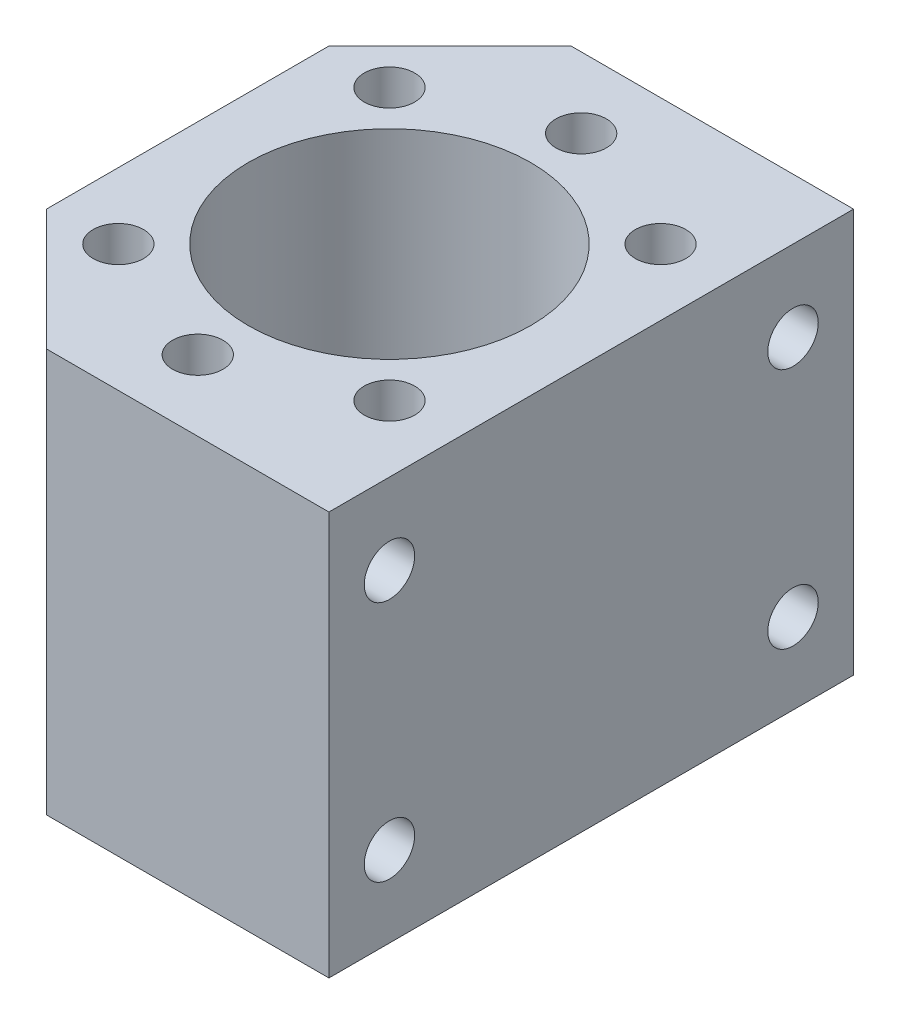
ISO-10303-21;
HEADER;
FILE_DESCRIPTION(('STEP AP214'),'2;1');
FILE_NAME('part.step','',(''),(''),'','','');
FILE_SCHEMA(('AUTOMOTIVE_DESIGN { 1 0 10303 214 1 1 1 1 }'));
ENDSEC;
DATA;
#1=APPLICATION_CONTEXT('core data for automotive mechanical design processes');
#2=APPLICATION_PROTOCOL_DEFINITION('international standard','automotive_design',2000,#1);
#3=PRODUCT_CONTEXT('',#1,'mechanical');
#4=PRODUCT('Part','Part','',(#3));
#5=PRODUCT_RELATED_PRODUCT_CATEGORY('part','',(#4));
#6=PRODUCT_DEFINITION_FORMATION('','',#4);
#7=PRODUCT_DEFINITION_CONTEXT('part definition',#1,'design');
#8=PRODUCT_DEFINITION('design','',#6,#7);
#9=PRODUCT_DEFINITION_SHAPE('','',#8);
#10=(LENGTH_UNIT() NAMED_UNIT(*) SI_UNIT(.MILLI.,.METRE.));
#11=(NAMED_UNIT(*) PLANE_ANGLE_UNIT() SI_UNIT($,.RADIAN.));
#12=(NAMED_UNIT(*) SI_UNIT($,.STERADIAN.) SOLID_ANGLE_UNIT());
#13=UNCERTAINTY_MEASURE_WITH_UNIT(LENGTH_MEASURE(1.E-05),#10,'distance_accuracy_value','');
#14=(GEOMETRIC_REPRESENTATION_CONTEXT(3) GLOBAL_UNCERTAINTY_ASSIGNED_CONTEXT((#13)) GLOBAL_UNIT_ASSIGNED_CONTEXT((#10,
#11,#12)) REPRESENTATION_CONTEXT('',''));
#15=CARTESIAN_POINT('',(0.,0.,0.));
#16=DIRECTION('',(0.,0.,1.));
#17=DIRECTION('',(1.,0.,0.));
#18=AXIS2_PLACEMENT_3D('',#15,#16,#17);
#19=CARTESIAN_POINT('',(0.,40.,52.));
#20=DIRECTION('',(1.,0.,0.));
#21=DIRECTION('',(0.,0.,-1.));
#22=AXIS2_PLACEMENT_3D('',#19,#20,#21);
#23=PLANE('',#22);
#24=DIRECTION('',(0.,0.,1.));
#25=VECTOR('',#24,1.);
#26=CARTESIAN_POINT('',(0.,40.,52.));
#27=LINE('',#26,#25);
#28=CARTESIAN_POINT('',(0.,40.,12.));
#29=VERTEX_POINT('',#28);
#30=CARTESIAN_POINT('',(0.,40.,40.));
#31=VERTEX_POINT('',#30);
#32=EDGE_CURVE('E109',#29,#31,#27,.T.);
#33=ORIENTED_EDGE('',*,*,#32,.F.);
#34=DIRECTION('',(0.,1.,0.));
#35=VECTOR('',#34,1.);
#36=CARTESIAN_POINT('',(0.,0.,12.));
#37=LINE('',#36,#35);
#38=CARTESIAN_POINT('',(0.,0.,12.));
#39=VERTEX_POINT('',#38);
#40=EDGE_CURVE('E101',#39,#29,#37,.T.);
#41=ORIENTED_EDGE('',*,*,#40,.F.);
#42=DIRECTION('',(0.,0.,1.));
#43=VECTOR('',#42,1.);
#44=CARTESIAN_POINT('',(0.,0.,52.));
#45=LINE('',#44,#43);
#46=CARTESIAN_POINT('',(0.,0.,40.));
#47=VERTEX_POINT('',#46);
#48=EDGE_CURVE('E70',#39,#47,#45,.T.);
#49=ORIENTED_EDGE('',*,*,#48,.T.);
#50=DIRECTION('',(0.,1.,0.));
#51=VECTOR('',#50,1.);
#52=CARTESIAN_POINT('',(0.,0.,40.));
#53=LINE('',#52,#51);
#54=EDGE_CURVE('E143',#47,#31,#53,.T.);
#55=ORIENTED_EDGE('',*,*,#54,.T.);
#56=EDGE_LOOP('',(#33,#41,#49,#55));
#57=FACE_BOUND('',#56,.T.);
#58=ADVANCED_FACE('F48',(#57),#23,.F.);
#59=CARTESIAN_POINT('',(40.,40.,52.));
#60=DIRECTION('',(0.,0.,-1.));
#61=DIRECTION('',(-1.,0.,0.));
#62=AXIS2_PLACEMENT_3D('',#59,#60,#61);
#63=PLANE('',#62);
#64=DIRECTION('',(1.,0.,0.));
#65=VECTOR('',#64,1.);
#66=CARTESIAN_POINT('',(40.,40.,52.));
#67=LINE('',#66,#65);
#68=CARTESIAN_POINT('',(12.,40.,52.));
#69=VERTEX_POINT('',#68);
#70=CARTESIAN_POINT('',(40.,40.,52.));
#71=VERTEX_POINT('',#70);
#72=EDGE_CURVE('E137',#69,#71,#67,.T.);
#73=ORIENTED_EDGE('',*,*,#72,.F.);
#74=DIRECTION('',(0.,1.,0.));
#75=VECTOR('',#74,1.);
#76=CARTESIAN_POINT('',(12.,0.,52.));
#77=LINE('',#76,#75);
#78=CARTESIAN_POINT('',(12.,0.,52.));
#79=VERTEX_POINT('',#78);
#80=EDGE_CURVE('E145',#79,#69,#77,.T.);
#81=ORIENTED_EDGE('',*,*,#80,.F.);
#82=DIRECTION('',(1.,0.,0.));
#83=VECTOR('',#82,1.);
#84=CARTESIAN_POINT('',(40.,0.,52.));
#85=LINE('',#84,#83);
#86=CARTESIAN_POINT('',(40.,0.,52.));
#87=VERTEX_POINT('',#86);
#88=EDGE_CURVE('E116',#79,#87,#85,.T.);
#89=ORIENTED_EDGE('',*,*,#88,.T.);
#90=DIRECTION('',(0.,-1.,0.));
#91=VECTOR('',#90,1.);
#92=CARTESIAN_POINT('',(40.,40.,52.));
#93=LINE('',#92,#91);
#94=EDGE_CURVE('E13',#71,#87,#93,.T.);
#95=ORIENTED_EDGE('',*,*,#94,.F.);
#96=EDGE_LOOP('',(#73,#81,#89,#95));
#97=FACE_BOUND('',#96,.T.);
#98=ADVANCED_FACE('F229',(#97),#63,.F.);
#99=CARTESIAN_POINT('',(40.,40.,0.));
#100=DIRECTION('',(-1.,0.,0.));
#101=DIRECTION('',(0.,0.,1.));
#102=AXIS2_PLACEMENT_3D('',#99,#100,#101);
#103=PLANE('',#102);
#104=CARTESIAN_POINT('',(40.,32.,6.));
#105=DIRECTION('',(1.,0.,0.));
#106=DIRECTION('',(0.,0.,-1.));
#107=AXIS2_PLACEMENT_3D('',#104,#105,#106);
#108=CIRCLE('',#107,2.5);
#109=CARTESIAN_POINT('',(40.,32.,3.5));
#110=VERTEX_POINT('',#109);
#111=EDGE_CURVE('E210',#110,#110,#108,.T.);
#112=ORIENTED_EDGE('',*,*,#111,.F.);
#113=EDGE_LOOP('',(#112));
#114=FACE_BOUND('',#113,.T.);
#115=CARTESIAN_POINT('',(40.,8.,6.));
#116=DIRECTION('',(1.,0.,0.));
#117=DIRECTION('',(0.,0.,-1.));
#118=AXIS2_PLACEMENT_3D('',#115,#116,#117);
#119=CIRCLE('',#118,2.5);
#120=CARTESIAN_POINT('',(40.,8.,3.5));
#121=VERTEX_POINT('',#120);
#122=EDGE_CURVE('E203',#121,#121,#119,.T.);
#123=ORIENTED_EDGE('',*,*,#122,.F.);
#124=EDGE_LOOP('',(#123));
#125=FACE_BOUND('',#124,.T.);
#126=CARTESIAN_POINT('',(40.,8.,46.));
#127=DIRECTION('',(1.,0.,0.));
#128=DIRECTION('',(0.,0.,-1.));
#129=AXIS2_PLACEMENT_3D('',#126,#127,#128);
#130=CIRCLE('',#129,2.5);
#131=CARTESIAN_POINT('',(40.,8.,43.5));
#132=VERTEX_POINT('',#131);
#133=EDGE_CURVE('E197',#132,#132,#130,.T.);
#134=ORIENTED_EDGE('',*,*,#133,.F.);
#135=EDGE_LOOP('',(#134));
#136=FACE_BOUND('',#135,.T.);
#137=CARTESIAN_POINT('',(40.,32.,46.));
#138=DIRECTION('',(1.,0.,0.));
#139=DIRECTION('',(0.,0.,-1.));
#140=AXIS2_PLACEMENT_3D('',#137,#138,#139);
#141=CIRCLE('',#140,2.5);
#142=CARTESIAN_POINT('',(40.,32.,43.5));
#143=VERTEX_POINT('',#142);
#144=EDGE_CURVE('E191',#143,#143,#141,.T.);
#145=ORIENTED_EDGE('',*,*,#144,.F.);
#146=EDGE_LOOP('',(#145));
#147=FACE_BOUND('',#146,.T.);
#148=DIRECTION('',(0.,0.,-1.));
#149=VECTOR('',#148,1.);
#150=CARTESIAN_POINT('',(40.,0.,0.));
#151=LINE('',#150,#149);
#152=CARTESIAN_POINT('',(40.,0.,0.));
#153=VERTEX_POINT('',#152);
#154=EDGE_CURVE('E119',#87,#153,#151,.T.);
#155=ORIENTED_EDGE('',*,*,#154,.T.);
#156=DIRECTION('',(0.,-1.,0.));
#157=VECTOR('',#156,1.);
#158=CARTESIAN_POINT('',(40.,40.,0.));
#159=LINE('',#158,#157);
#160=CARTESIAN_POINT('',(40.,40.,0.));
#161=VERTEX_POINT('',#160);
#162=EDGE_CURVE('E55',#161,#153,#159,.T.);
#163=ORIENTED_EDGE('',*,*,#162,.F.);
#164=DIRECTION('',(0.,0.,-1.));
#165=VECTOR('',#164,1.);
#166=CARTESIAN_POINT('',(40.,40.,0.));
#167=LINE('',#166,#165);
#168=EDGE_CURVE('E135',#71,#161,#167,.T.);
#169=ORIENTED_EDGE('',*,*,#168,.F.);
#170=ORIENTED_EDGE('',*,*,#94,.T.);
#171=EDGE_LOOP('',(#155,#163,#169,#170));
#172=FACE_BOUND('',#171,.T.);
#173=ADVANCED_FACE('F225',(#114,#125,#136,#147,#172),#103,.F.);
#174=CARTESIAN_POINT('',(0.,40.,0.));
#175=DIRECTION('',(0.,0.,1.));
#176=DIRECTION('',(1.,0.,0.));
#177=AXIS2_PLACEMENT_3D('',#174,#175,#176);
#178=PLANE('',#177);
#179=DIRECTION('',(-1.,0.,0.));
#180=VECTOR('',#179,1.);
#181=CARTESIAN_POINT('',(0.,0.,0.));
#182=LINE('',#181,#180);
#183=CARTESIAN_POINT('',(12.,0.,0.));
#184=VERTEX_POINT('',#183);
#185=EDGE_CURVE('E129',#153,#184,#182,.T.);
#186=ORIENTED_EDGE('',*,*,#185,.T.);
#187=DIRECTION('',(0.,1.,0.));
#188=VECTOR('',#187,1.);
#189=CARTESIAN_POINT('',(12.,0.,0.));
#190=LINE('',#189,#188);
#191=CARTESIAN_POINT('',(12.,40.,0.));
#192=VERTEX_POINT('',#191);
#193=EDGE_CURVE('E62',#184,#192,#190,.T.);
#194=ORIENTED_EDGE('',*,*,#193,.T.);
#195=DIRECTION('',(-1.,0.,0.));
#196=VECTOR('',#195,1.);
#197=CARTESIAN_POINT('',(0.,40.,0.));
#198=LINE('',#197,#196);
#199=EDGE_CURVE('E125',#161,#192,#198,.T.);
#200=ORIENTED_EDGE('',*,*,#199,.F.);
#201=ORIENTED_EDGE('',*,*,#162,.T.);
#202=EDGE_LOOP('',(#186,#194,#200,#201));
#203=FACE_BOUND('',#202,.T.);
#204=ADVANCED_FACE('F228',(#203),#178,.F.);
#205=CARTESIAN_POINT('',(0.,40.,0.));
#206=DIRECTION('',(0.,-1.,0.));
#207=DIRECTION('',(0.,0.,-1.));
#208=AXIS2_PLACEMENT_3D('',#205,#206,#207);
#209=PLANE('',#208);
#210=CARTESIAN_POINT('',(6.56497115745562,40.,39.4350288425444));
#211=DIRECTION('',(0.,1.,0.));
#212=DIRECTION('',(0.,0.,1.));
#213=AXIS2_PLACEMENT_3D('',#210,#211,#212);
#214=CIRCLE('',#213,2.5);
#215=CARTESIAN_POINT('',(6.56497115745562,40.,41.9350288425444));
#216=VERTEX_POINT('',#215);
#217=EDGE_CURVE('E185',#216,#216,#214,.T.);
#218=ORIENTED_EDGE('',*,*,#217,.F.);
#219=EDGE_LOOP('',(#218));
#220=FACE_BOUND('',#219,.T.);
#221=CARTESIAN_POINT('',(6.56497115745562,40.,12.5649711574556));
#222=DIRECTION('',(0.,1.,0.));
#223=DIRECTION('',(0.,0.,1.));
#224=AXIS2_PLACEMENT_3D('',#221,#222,#223);
#225=CIRCLE('',#224,2.5);
#226=CARTESIAN_POINT('',(6.56497115745562,40.,15.0649711574556));
#227=VERTEX_POINT('',#226);
#228=EDGE_CURVE('E179',#227,#227,#225,.T.);
#229=ORIENTED_EDGE('',*,*,#228,.F.);
#230=EDGE_LOOP('',(#229));
#231=FACE_BOUND('',#230,.T.);
#232=CARTESIAN_POINT('',(33.4350288425444,40.,12.5649711574556));
#233=DIRECTION('',(0.,1.,0.));
#234=DIRECTION('',(0.,0.,1.));
#235=AXIS2_PLACEMENT_3D('',#232,#233,#234);
#236=CIRCLE('',#235,2.5);
#237=CARTESIAN_POINT('',(33.4350288425444,40.,15.0649711574556));
#238=VERTEX_POINT('',#237);
#239=EDGE_CURVE('E173',#238,#238,#236,.T.);
#240=ORIENTED_EDGE('',*,*,#239,.F.);
#241=EDGE_LOOP('',(#240));
#242=FACE_BOUND('',#241,.T.);
#243=CARTESIAN_POINT('',(33.4350288425444,40.,39.4350288425444));
#244=DIRECTION('',(0.,1.,0.));
#245=DIRECTION('',(0.,0.,1.));
#246=AXIS2_PLACEMENT_3D('',#243,#244,#245);
#247=CIRCLE('',#246,2.5);
#248=CARTESIAN_POINT('',(33.4350288425444,40.,41.9350288425444));
#249=VERTEX_POINT('',#248);
#250=EDGE_CURVE('E167',#249,#249,#247,.T.);
#251=ORIENTED_EDGE('',*,*,#250,.F.);
#252=EDGE_LOOP('',(#251));
#253=FACE_BOUND('',#252,.T.);
#254=CARTESIAN_POINT('',(20.,40.,45.));
#255=DIRECTION('',(0.,1.,0.));
#256=DIRECTION('',(0.,0.,1.));
#257=AXIS2_PLACEMENT_3D('',#254,#255,#256);
#258=CIRCLE('',#257,2.5);
#259=CARTESIAN_POINT('',(20.,40.,47.5));
#260=VERTEX_POINT('',#259);
#261=EDGE_CURVE('E161',#260,#260,#258,.T.);
#262=ORIENTED_EDGE('',*,*,#261,.F.);
#263=EDGE_LOOP('',(#262));
#264=FACE_BOUND('',#263,.T.);
#265=CARTESIAN_POINT('',(20.,40.,7.));
#266=DIRECTION('',(0.,1.,0.));
#267=DIRECTION('',(0.,0.,1.));
#268=AXIS2_PLACEMENT_3D('',#265,#266,#267);
#269=CIRCLE('',#268,2.5);
#270=CARTESIAN_POINT('',(20.,40.,9.5));
#271=VERTEX_POINT('',#270);
#272=EDGE_CURVE('E155',#271,#271,#269,.T.);
#273=ORIENTED_EDGE('',*,*,#272,.F.);
#274=EDGE_LOOP('',(#273));
#275=FACE_BOUND('',#274,.T.);
#276=CARTESIAN_POINT('',(20.,40.,26.));
#277=DIRECTION('',(0.,1.,0.));
#278=DIRECTION('',(0.,0.,1.));
#279=AXIS2_PLACEMENT_3D('',#276,#277,#278);
#280=CIRCLE('',#279,14.);
#281=CARTESIAN_POINT('',(20.,40.,40.));
#282=VERTEX_POINT('',#281);
#283=EDGE_CURVE('E122',#282,#282,#280,.T.);
#284=ORIENTED_EDGE('',*,*,#283,.F.);
#285=EDGE_LOOP('',(#284));
#286=FACE_BOUND('',#285,.T.);
#287=ORIENTED_EDGE('',*,*,#199,.T.);
#288=DIRECTION('',(0.707106781186548,0.,-0.707106781186547));
#289=VECTOR('',#288,1.);
#290=CARTESIAN_POINT('',(0.,40.,12.));
#291=LINE('',#290,#289);
#292=EDGE_CURVE('E106',#29,#192,#291,.T.);
#293=ORIENTED_EDGE('',*,*,#292,.F.);
#294=ORIENTED_EDGE('',*,*,#32,.T.);
#295=DIRECTION('',(-0.707106781186547,0.,-0.707106781186548));
#296=VECTOR('',#295,1.);
#297=CARTESIAN_POINT('',(0.,40.,40.));
#298=LINE('',#297,#296);
#299=EDGE_CURVE('E148',#69,#31,#298,.T.);
#300=ORIENTED_EDGE('',*,*,#299,.F.);
#301=ORIENTED_EDGE('',*,*,#72,.T.);
#302=ORIENTED_EDGE('',*,*,#168,.T.);
#303=EDGE_LOOP('',(#287,#293,#294,#300,#301,#302));
#304=FACE_BOUND('',#303,.T.);
#305=ADVANCED_FACE('F240',(#220,#231,#242,#253,#264,#275,#286,#304),#209,.F.);
#306=CARTESIAN_POINT('',(0.,0.,0.));
#307=DIRECTION('',(0.,-1.,0.));
#308=DIRECTION('',(0.,0.,-1.));
#309=AXIS2_PLACEMENT_3D('',#306,#307,#308);
#310=PLANE('',#309);
#311=DIRECTION('',(0.707106781186548,0.,-0.707106781186547));
#312=VECTOR('',#311,1.);
#313=CARTESIAN_POINT('',(0.,0.,12.));
#314=LINE('',#313,#312);
#315=EDGE_CURVE('E99',#39,#184,#314,.T.);
#316=ORIENTED_EDGE('',*,*,#315,.T.);
#317=ORIENTED_EDGE('',*,*,#185,.F.);
#318=ORIENTED_EDGE('',*,*,#154,.F.);
#319=ORIENTED_EDGE('',*,*,#88,.F.);
#320=DIRECTION('',(-0.707106781186547,0.,-0.707106781186548));
#321=VECTOR('',#320,1.);
#322=CARTESIAN_POINT('',(0.,0.,40.));
#323=LINE('',#322,#321);
#324=EDGE_CURVE('E115',#79,#47,#323,.T.);
#325=ORIENTED_EDGE('',*,*,#324,.T.);
#326=ORIENTED_EDGE('',*,*,#48,.F.);
#327=EDGE_LOOP('',(#316,#317,#318,#319,#325,#326));
#328=FACE_BOUND('',#327,.T.);
#329=CARTESIAN_POINT('',(20.,0.,26.));
#330=DIRECTION('',(0.,1.,0.));
#331=DIRECTION('',(0.,0.,1.));
#332=AXIS2_PLACEMENT_3D('',#329,#330,#331);
#333=CIRCLE('',#332,14.);
#334=CARTESIAN_POINT('',(20.,0.,40.));
#335=VERTEX_POINT('',#334);
#336=EDGE_CURVE('E117',#335,#335,#333,.T.);
#337=ORIENTED_EDGE('',*,*,#336,.T.);
#338=EDGE_LOOP('',(#337));
#339=FACE_BOUND('',#338,.T.);
#340=ADVANCED_FACE('F112',(#328,#339),#310,.T.);
#341=CARTESIAN_POINT('',(20.,0.,26.));
#342=DIRECTION('',(0.,1.,0.));
#343=DIRECTION('',(0.,0.,1.));
#344=AXIS2_PLACEMENT_3D('',#341,#342,#343);
#345=CYLINDRICAL_SURFACE('',#344,14.);
#346=ORIENTED_EDGE('',*,*,#336,.F.);
#347=EDGE_LOOP('',(#346));
#348=FACE_BOUND('',#347,.T.);
#349=ORIENTED_EDGE('',*,*,#283,.T.);
#350=EDGE_LOOP('',(#349));
#351=FACE_BOUND('',#350,.T.);
#352=ADVANCED_FACE('F261',(#348,#351),#345,.F.);
#353=CARTESIAN_POINT('',(0.,0.,40.));
#354=DIRECTION('',(0.707106781186548,0.,-0.707106781186547));
#355=DIRECTION('',(-0.707106781186547,0.,-0.707106781186548));
#356=AXIS2_PLACEMENT_3D('',#353,#354,#355);
#357=PLANE('',#356);
#358=ORIENTED_EDGE('',*,*,#299,.T.);
#359=ORIENTED_EDGE('',*,*,#54,.F.);
#360=ORIENTED_EDGE('',*,*,#324,.F.);
#361=ORIENTED_EDGE('',*,*,#80,.T.);
#362=EDGE_LOOP('',(#358,#359,#360,#361));
#363=FACE_BOUND('',#362,.T.);
#364=ADVANCED_FACE('F259',(#363),#357,.F.);
#365=CARTESIAN_POINT('',(0.,0.,12.));
#366=DIRECTION('',(0.707106781186547,0.,0.707106781186548));
#367=DIRECTION('',(0.707106781186548,0.,-0.707106781186547));
#368=AXIS2_PLACEMENT_3D('',#365,#366,#367);
#369=PLANE('',#368);
#370=ORIENTED_EDGE('',*,*,#292,.T.);
#371=ORIENTED_EDGE('',*,*,#193,.F.);
#372=ORIENTED_EDGE('',*,*,#315,.F.);
#373=ORIENTED_EDGE('',*,*,#40,.T.);
#374=EDGE_LOOP('',(#370,#371,#372,#373));
#375=FACE_BOUND('',#374,.T.);
#376=ADVANCED_FACE('F100',(#375),#369,.F.);
#377=CARTESIAN_POINT('',(20.,20.,7.));
#378=DIRECTION('',(0.,1.,0.));
#379=DIRECTION('',(0.,0.,1.));
#380=AXIS2_PLACEMENT_3D('',#377,#378,#379);
#381=CYLINDRICAL_SURFACE('',#380,2.5);
#382=CARTESIAN_POINT('',(20.,20.,7.));
#383=DIRECTION('',(0.,1.,0.));
#384=DIRECTION('',(0.,0.,1.));
#385=AXIS2_PLACEMENT_3D('',#382,#383,#384);
#386=CIRCLE('',#385,2.5);
#387=CARTESIAN_POINT('',(20.,20.,9.5));
#388=VERTEX_POINT('',#387);
#389=EDGE_CURVE('E153',#388,#388,#386,.T.);
#390=ORIENTED_EDGE('',*,*,#389,.F.);
#391=EDGE_LOOP('',(#390));
#392=FACE_BOUND('',#391,.T.);
#393=ORIENTED_EDGE('',*,*,#272,.T.);
#394=EDGE_LOOP('',(#393));
#395=FACE_BOUND('',#394,.T.);
#396=ADVANCED_FACE('F267',(#392,#395),#381,.F.);
#397=CARTESIAN_POINT('',(20.,20.,7.));
#398=DIRECTION('',(0.,1.,0.));
#399=DIRECTION('',(0.,0.,1.));
#400=AXIS2_PLACEMENT_3D('',#397,#398,#399);
#401=PLANE('',#400);
#402=ORIENTED_EDGE('',*,*,#389,.T.);
#403=EDGE_LOOP('',(#402));
#404=FACE_BOUND('',#403,.T.);
#405=ADVANCED_FACE('F316',(#404),#401,.T.);
#406=CARTESIAN_POINT('',(20.,20.,45.));
#407=DIRECTION('',(0.,1.,0.));
#408=DIRECTION('',(0.,0.,1.));
#409=AXIS2_PLACEMENT_3D('',#406,#407,#408);
#410=CYLINDRICAL_SURFACE('',#409,2.5);
#411=CARTESIAN_POINT('',(20.,20.,45.));
#412=DIRECTION('',(0.,1.,0.));
#413=DIRECTION('',(0.,0.,1.));
#414=AXIS2_PLACEMENT_3D('',#411,#412,#413);
#415=CIRCLE('',#414,2.5);
#416=CARTESIAN_POINT('',(20.,20.,47.5));
#417=VERTEX_POINT('',#416);
#418=EDGE_CURVE('E158',#417,#417,#415,.T.);
#419=ORIENTED_EDGE('',*,*,#418,.F.);
#420=EDGE_LOOP('',(#419));
#421=FACE_BOUND('',#420,.T.);
#422=ORIENTED_EDGE('',*,*,#261,.T.);
#423=EDGE_LOOP('',(#422));
#424=FACE_BOUND('',#423,.T.);
#425=ADVANCED_FACE('F325',(#421,#424),#410,.F.);
#426=CARTESIAN_POINT('',(20.,20.,45.));
#427=DIRECTION('',(0.,1.,0.));
#428=DIRECTION('',(0.,0.,1.));
#429=AXIS2_PLACEMENT_3D('',#426,#427,#428);
#430=PLANE('',#429);
#431=ORIENTED_EDGE('',*,*,#418,.T.);
#432=EDGE_LOOP('',(#431));
#433=FACE_BOUND('',#432,.T.);
#434=ADVANCED_FACE('F335',(#433),#430,.T.);
#435=CARTESIAN_POINT('',(33.4350288425444,20.,39.4350288425444));
#436=DIRECTION('',(0.,1.,0.));
#437=DIRECTION('',(0.,0.,1.));
#438=AXIS2_PLACEMENT_3D('',#435,#436,#437);
#439=CYLINDRICAL_SURFACE('',#438,2.5);
#440=CARTESIAN_POINT('',(33.4350288425444,20.,39.4350288425444));
#441=DIRECTION('',(0.,1.,0.));
#442=DIRECTION('',(0.,0.,1.));
#443=AXIS2_PLACEMENT_3D('',#440,#441,#442);
#444=CIRCLE('',#443,2.5);
#445=CARTESIAN_POINT('',(33.4350288425444,20.,41.9350288425444));
#446=VERTEX_POINT('',#445);
#447=EDGE_CURVE('E164',#446,#446,#444,.T.);
#448=ORIENTED_EDGE('',*,*,#447,.F.);
#449=EDGE_LOOP('',(#448));
#450=FACE_BOUND('',#449,.T.);
#451=ORIENTED_EDGE('',*,*,#250,.T.);
#452=EDGE_LOOP('',(#451));
#453=FACE_BOUND('',#452,.T.);
#454=ADVANCED_FACE('F345',(#450,#453),#439,.F.);
#455=CARTESIAN_POINT('',(33.4350288425444,20.,39.4350288425444));
#456=DIRECTION('',(0.,1.,0.));
#457=DIRECTION('',(0.,0.,1.));
#458=AXIS2_PLACEMENT_3D('',#455,#456,#457);
#459=PLANE('',#458);
#460=ORIENTED_EDGE('',*,*,#447,.T.);
#461=EDGE_LOOP('',(#460));
#462=FACE_BOUND('',#461,.T.);
#463=ADVANCED_FACE('F355',(#462),#459,.T.);
#464=CARTESIAN_POINT('',(33.4350288425444,20.,12.5649711574556));
#465=DIRECTION('',(0.,1.,0.));
#466=DIRECTION('',(0.,0.,1.));
#467=AXIS2_PLACEMENT_3D('',#464,#465,#466);
#468=CYLINDRICAL_SURFACE('',#467,2.5);
#469=CARTESIAN_POINT('',(33.4350288425444,20.,12.5649711574556));
#470=DIRECTION('',(0.,1.,0.));
#471=DIRECTION('',(0.,0.,1.));
#472=AXIS2_PLACEMENT_3D('',#469,#470,#471);
#473=CIRCLE('',#472,2.5);
#474=CARTESIAN_POINT('',(33.4350288425444,20.,15.0649711574556));
#475=VERTEX_POINT('',#474);
#476=EDGE_CURVE('E170',#475,#475,#473,.T.);
#477=ORIENTED_EDGE('',*,*,#476,.F.);
#478=EDGE_LOOP('',(#477));
#479=FACE_BOUND('',#478,.T.);
#480=ORIENTED_EDGE('',*,*,#239,.T.);
#481=EDGE_LOOP('',(#480));
#482=FACE_BOUND('',#481,.T.);
#483=ADVANCED_FACE('F365',(#479,#482),#468,.F.);
#484=CARTESIAN_POINT('',(33.4350288425444,20.,12.5649711574556));
#485=DIRECTION('',(0.,1.,0.));
#486=DIRECTION('',(0.,0.,1.));
#487=AXIS2_PLACEMENT_3D('',#484,#485,#486);
#488=PLANE('',#487);
#489=ORIENTED_EDGE('',*,*,#476,.T.);
#490=EDGE_LOOP('',(#489));
#491=FACE_BOUND('',#490,.T.);
#492=ADVANCED_FACE('F375',(#491),#488,.T.);
#493=CARTESIAN_POINT('',(6.56497115745562,20.,12.5649711574556));
#494=DIRECTION('',(0.,1.,0.));
#495=DIRECTION('',(0.,0.,1.));
#496=AXIS2_PLACEMENT_3D('',#493,#494,#495);
#497=CYLINDRICAL_SURFACE('',#496,2.5);
#498=CARTESIAN_POINT('',(6.56497115745562,20.,12.5649711574556));
#499=DIRECTION('',(0.,1.,0.));
#500=DIRECTION('',(0.,0.,1.));
#501=AXIS2_PLACEMENT_3D('',#498,#499,#500);
#502=CIRCLE('',#501,2.5);
#503=CARTESIAN_POINT('',(6.56497115745562,20.,15.0649711574556));
#504=VERTEX_POINT('',#503);
#505=EDGE_CURVE('E176',#504,#504,#502,.T.);
#506=ORIENTED_EDGE('',*,*,#505,.F.);
#507=EDGE_LOOP('',(#506));
#508=FACE_BOUND('',#507,.T.);
#509=ORIENTED_EDGE('',*,*,#228,.T.);
#510=EDGE_LOOP('',(#509));
#511=FACE_BOUND('',#510,.T.);
#512=ADVANCED_FACE('F385',(#508,#511),#497,.F.);
#513=CARTESIAN_POINT('',(6.56497115745562,20.,12.5649711574556));
#514=DIRECTION('',(0.,1.,0.));
#515=DIRECTION('',(0.,0.,1.));
#516=AXIS2_PLACEMENT_3D('',#513,#514,#515);
#517=PLANE('',#516);
#518=ORIENTED_EDGE('',*,*,#505,.T.);
#519=EDGE_LOOP('',(#518));
#520=FACE_BOUND('',#519,.T.);
#521=ADVANCED_FACE('F395',(#520),#517,.T.);
#522=CARTESIAN_POINT('',(6.56497115745562,20.,39.4350288425444));
#523=DIRECTION('',(0.,1.,0.));
#524=DIRECTION('',(0.,0.,1.));
#525=AXIS2_PLACEMENT_3D('',#522,#523,#524);
#526=CYLINDRICAL_SURFACE('',#525,2.5);
#527=CARTESIAN_POINT('',(6.56497115745562,20.,39.4350288425444));
#528=DIRECTION('',(0.,1.,0.));
#529=DIRECTION('',(0.,0.,1.));
#530=AXIS2_PLACEMENT_3D('',#527,#528,#529);
#531=CIRCLE('',#530,2.5);
#532=CARTESIAN_POINT('',(6.56497115745562,20.,41.9350288425444));
#533=VERTEX_POINT('',#532);
#534=EDGE_CURVE('E182',#533,#533,#531,.T.);
#535=ORIENTED_EDGE('',*,*,#534,.F.);
#536=EDGE_LOOP('',(#535));
#537=FACE_BOUND('',#536,.T.);
#538=ORIENTED_EDGE('',*,*,#217,.T.);
#539=EDGE_LOOP('',(#538));
#540=FACE_BOUND('',#539,.T.);
#541=ADVANCED_FACE('F405',(#537,#540),#526,.F.);
#542=CARTESIAN_POINT('',(6.56497115745562,20.,39.4350288425444));
#543=DIRECTION('',(0.,1.,0.));
#544=DIRECTION('',(0.,0.,1.));
#545=AXIS2_PLACEMENT_3D('',#542,#543,#544);
#546=PLANE('',#545);
#547=ORIENTED_EDGE('',*,*,#534,.T.);
#548=EDGE_LOOP('',(#547));
#549=FACE_BOUND('',#548,.T.);
#550=ADVANCED_FACE('F415',(#549),#546,.T.);
#551=CARTESIAN_POINT('',(25.,32.,46.));
#552=DIRECTION('',(1.,0.,0.));
#553=DIRECTION('',(0.,0.,-1.));
#554=AXIS2_PLACEMENT_3D('',#551,#552,#553);
#555=CYLINDRICAL_SURFACE('',#554,2.5);
#556=CARTESIAN_POINT('',(25.,32.,46.));
#557=DIRECTION('',(1.,0.,0.));
#558=DIRECTION('',(0.,0.,-1.));
#559=AXIS2_PLACEMENT_3D('',#556,#557,#558);
#560=CIRCLE('',#559,2.5);
#561=CARTESIAN_POINT('',(25.,32.,43.5));
#562=VERTEX_POINT('',#561);
#563=EDGE_CURVE('E188',#562,#562,#560,.T.);
#564=ORIENTED_EDGE('',*,*,#563,.F.);
#565=EDGE_LOOP('',(#564));
#566=FACE_BOUND('',#565,.T.);
#567=ORIENTED_EDGE('',*,*,#144,.T.);
#568=EDGE_LOOP('',(#567));
#569=FACE_BOUND('',#568,.T.);
#570=ADVANCED_FACE('F424',(#566,#569),#555,.F.);
#571=CARTESIAN_POINT('',(25.,32.,46.));
#572=DIRECTION('',(1.,0.,0.));
#573=DIRECTION('',(0.,0.,-1.));
#574=AXIS2_PLACEMENT_3D('',#571,#572,#573);
#575=PLANE('',#574);
#576=ORIENTED_EDGE('',*,*,#563,.T.);
#577=EDGE_LOOP('',(#576));
#578=FACE_BOUND('',#577,.T.);
#579=ADVANCED_FACE('F438',(#578),#575,.T.);
#580=CARTESIAN_POINT('',(25.,8.,46.));
#581=DIRECTION('',(1.,0.,0.));
#582=DIRECTION('',(0.,0.,-1.));
#583=AXIS2_PLACEMENT_3D('',#580,#581,#582);
#584=CYLINDRICAL_SURFACE('',#583,2.5);
#585=CARTESIAN_POINT('',(25.,8.,46.));
#586=DIRECTION('',(1.,0.,0.));
#587=DIRECTION('',(0.,0.,-1.));
#588=AXIS2_PLACEMENT_3D('',#585,#586,#587);
#589=CIRCLE('',#588,2.5);
#590=CARTESIAN_POINT('',(25.,8.,43.5));
#591=VERTEX_POINT('',#590);
#592=EDGE_CURVE('E194',#591,#591,#589,.T.);
#593=ORIENTED_EDGE('',*,*,#592,.F.);
#594=EDGE_LOOP('',(#593));
#595=FACE_BOUND('',#594,.T.);
#596=ORIENTED_EDGE('',*,*,#133,.T.);
#597=EDGE_LOOP('',(#596));
#598=FACE_BOUND('',#597,.T.);
#599=ADVANCED_FACE('F448',(#595,#598),#584,.F.);
#600=CARTESIAN_POINT('',(25.,8.,46.));
#601=DIRECTION('',(1.,0.,0.));
#602=DIRECTION('',(0.,0.,-1.));
#603=AXIS2_PLACEMENT_3D('',#600,#601,#602);
#604=PLANE('',#603);
#605=ORIENTED_EDGE('',*,*,#592,.T.);
#606=EDGE_LOOP('',(#605));
#607=FACE_BOUND('',#606,.T.);
#608=ADVANCED_FACE('F458',(#607),#604,.T.);
#609=CARTESIAN_POINT('',(25.,8.,6.));
#610=DIRECTION('',(1.,0.,0.));
#611=DIRECTION('',(0.,0.,-1.));
#612=AXIS2_PLACEMENT_3D('',#609,#610,#611);
#613=CYLINDRICAL_SURFACE('',#612,2.5);
#614=CARTESIAN_POINT('',(25.,8.,6.));
#615=DIRECTION('',(1.,0.,0.));
#616=DIRECTION('',(0.,0.,-1.));
#617=AXIS2_PLACEMENT_3D('',#614,#615,#616);
#618=CIRCLE('',#617,2.5);
#619=CARTESIAN_POINT('',(25.,8.,3.5));
#620=VERTEX_POINT('',#619);
#621=EDGE_CURVE('E200',#620,#620,#618,.T.);
#622=ORIENTED_EDGE('',*,*,#621,.F.);
#623=EDGE_LOOP('',(#622));
#624=FACE_BOUND('',#623,.T.);
#625=ORIENTED_EDGE('',*,*,#122,.T.);
#626=EDGE_LOOP('',(#625));
#627=FACE_BOUND('',#626,.T.);
#628=ADVANCED_FACE('F468',(#624,#627),#613,.F.);
#629=CARTESIAN_POINT('',(25.,8.,6.));
#630=DIRECTION('',(1.,0.,0.));
#631=DIRECTION('',(0.,0.,-1.));
#632=AXIS2_PLACEMENT_3D('',#629,#630,#631);
#633=PLANE('',#632);
#634=ORIENTED_EDGE('',*,*,#621,.T.);
#635=EDGE_LOOP('',(#634));
#636=FACE_BOUND('',#635,.T.);
#637=ADVANCED_FACE('F221',(#636),#633,.T.);
#638=CARTESIAN_POINT('',(25.,32.,6.));
#639=DIRECTION('',(1.,0.,0.));
#640=DIRECTION('',(0.,0.,-1.));
#641=AXIS2_PLACEMENT_3D('',#638,#639,#640);
#642=CYLINDRICAL_SURFACE('',#641,2.5);
#643=CARTESIAN_POINT('',(25.,32.,6.));
#644=DIRECTION('',(1.,0.,0.));
#645=DIRECTION('',(0.,0.,-1.));
#646=AXIS2_PLACEMENT_3D('',#643,#644,#645);
#647=CIRCLE('',#646,2.5);
#648=CARTESIAN_POINT('',(25.,32.,3.5));
#649=VERTEX_POINT('',#648);
#650=EDGE_CURVE('E207',#649,#649,#647,.T.);
#651=ORIENTED_EDGE('',*,*,#650,.F.);
#652=EDGE_LOOP('',(#651));
#653=FACE_BOUND('',#652,.T.);
#654=ORIENTED_EDGE('',*,*,#111,.T.);
#655=EDGE_LOOP('',(#654));
#656=FACE_BOUND('',#655,.T.);
#657=ADVANCED_FACE('F218',(#653,#656),#642,.F.);
#658=CARTESIAN_POINT('',(25.,32.,6.));
#659=DIRECTION('',(1.,0.,0.));
#660=DIRECTION('',(0.,0.,-1.));
#661=AXIS2_PLACEMENT_3D('',#658,#659,#660);
#662=PLANE('',#661);
#663=ORIENTED_EDGE('',*,*,#650,.T.);
#664=EDGE_LOOP('',(#663));
#665=FACE_BOUND('',#664,.T.);
#666=ADVANCED_FACE('F216',(#665),#662,.T.);
#667=CLOSED_SHELL('',(#58,#98,#173,#204,#305,#340,#352,#364,#376,#396,#405,#425,#434,#454,#463,
#483,#492,#512,#521,#541,#550,#570,#579,#599,#608,#628,#637,#657,#666));
#668=MANIFOLD_SOLID_BREP('B2',#667);
#669=ADVANCED_BREP_SHAPE_REPRESENTATION('',(#18,#668),#14);
#670=SHAPE_DEFINITION_REPRESENTATION(#9,#669);
ENDSEC;
END-ISO-10303-21;
